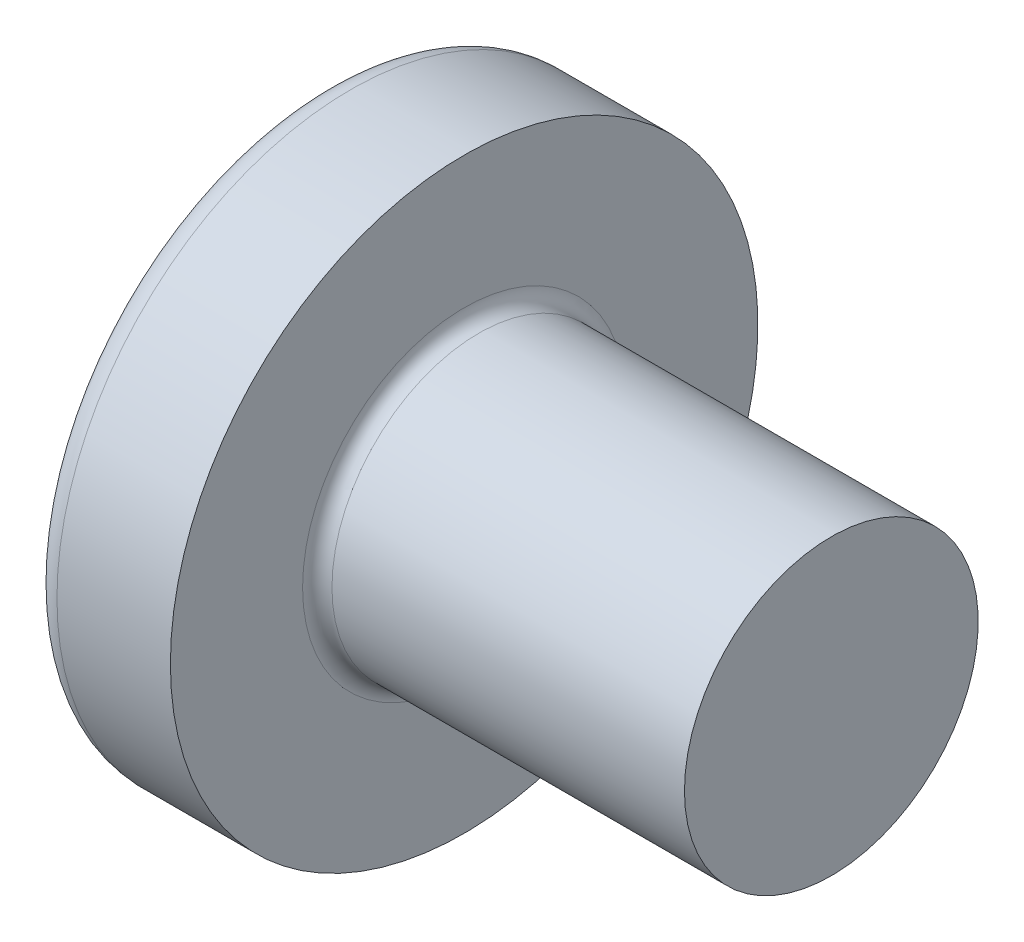
ISO-10303-21;
HEADER;
FILE_DESCRIPTION(('STEP AP214'),'2;1');
FILE_NAME('part.step','',(''),(''),'','','');
FILE_SCHEMA(('AUTOMOTIVE_DESIGN { 1 0 10303 214 1 1 1 1 }'));
ENDSEC;
DATA;
#1=APPLICATION_CONTEXT('core data for automotive mechanical design processes');
#2=APPLICATION_PROTOCOL_DEFINITION('international standard','automotive_design',2000,#1);
#3=PRODUCT_CONTEXT('',#1,'mechanical');
#4=PRODUCT('Part','Part','',(#3));
#5=PRODUCT_RELATED_PRODUCT_CATEGORY('part','',(#4));
#6=PRODUCT_DEFINITION_FORMATION('','',#4);
#7=PRODUCT_DEFINITION_CONTEXT('part definition',#1,'design');
#8=PRODUCT_DEFINITION('design','',#6,#7);
#9=PRODUCT_DEFINITION_SHAPE('','',#8);
#10=(LENGTH_UNIT() NAMED_UNIT(*) SI_UNIT(.MILLI.,.METRE.));
#11=(NAMED_UNIT(*) PLANE_ANGLE_UNIT() SI_UNIT($,.RADIAN.));
#12=(NAMED_UNIT(*) SI_UNIT($,.STERADIAN.) SOLID_ANGLE_UNIT());
#13=UNCERTAINTY_MEASURE_WITH_UNIT(LENGTH_MEASURE(1.E-05),#10,'distance_accuracy_value','');
#14=(GEOMETRIC_REPRESENTATION_CONTEXT(3) GLOBAL_UNCERTAINTY_ASSIGNED_CONTEXT((#13)) GLOBAL_UNIT_ASSIGNED_CONTEXT((#10,
#11,#12)) REPRESENTATION_CONTEXT('',''));
#15=CARTESIAN_POINT('',(0.,0.,0.));
#16=DIRECTION('',(0.,0.,1.));
#17=DIRECTION('',(1.,0.,0.));
#18=AXIS2_PLACEMENT_3D('',#15,#16,#17);
#19=CARTESIAN_POINT('',(6.5,0.,0.));
#20=DIRECTION('',(-1.,0.,0.));
#21=DIRECTION('',(0.,1.,0.));
#22=AXIS2_PLACEMENT_3D('',#19,#20,#21);
#23=SPHERICAL_SURFACE('',#22,6.5);
#24=CARTESIAN_POINT('',(1.26538895452803,0.,0.));
#25=DIRECTION('',(-1.,0.,0.));
#26=DIRECTION('',(0.,0.,1.));
#27=AXIS2_PLACEMENT_3D('',#24,#25,#26);
#28=CIRCLE('',#27,3.85342019543974);
#29=CARTESIAN_POINT('',(1.26538895452803,0.,3.85342019543974));
#30=VERTEX_POINT('',#29);
#31=EDGE_CURVE('E226',#30,#30,#28,.T.);
#32=ORIENTED_EDGE('',*,*,#31,.T.);
#33=EDGE_LOOP('',(#32));
#34=FACE_BOUND('',#33,.T.);
#35=CARTESIAN_POINT('',(0.0788099820016241,0.,0.));
#36=DIRECTION('',(1.,0.,0.));
#37=DIRECTION('',(0.,0.,-1.));
#38=AXIS2_PLACEMENT_3D('',#35,#36,#37);
#39=CIRCLE('',#38,1.0091178091571);
#40=CARTESIAN_POINT('',(0.0788099820016238,-0.514999999999996,-0.867809744562728));
#41=VERTEX_POINT('',#40);
#42=CARTESIAN_POINT('',(0.0788099820016241,-0.867809744562729,-0.515));
#43=VERTEX_POINT('',#42);
#44=EDGE_CURVE('E385',#41,#43,#39,.F.);
#45=ORIENTED_EDGE('',*,*,#44,.F.);
#46=CARTESIAN_POINT('',(6.5,-0.515,0.));
#47=DIRECTION('',(0.,1.,0.));
#48=DIRECTION('',(0.,0.,1.));
#49=AXIS2_PLACEMENT_3D('',#46,#47,#48);
#50=CIRCLE('',#49,6.47956595768575);
#51=CARTESIAN_POINT('',(0.331830520157864,-0.514999999999992,-1.98455543332606));
#52=VERTEX_POINT('',#51);
#53=EDGE_CURVE('E301',#52,#41,#50,.T.);
#54=ORIENTED_EDGE('',*,*,#53,.F.);
#55=CARTESIAN_POINT('',(6.06443225879636,0.,0.873613881877686));
#56=DIRECTION('',(0.446197753347362,0.,-0.89493439139848));
#57=DIRECTION('',(-0.89493439139848,0.,-0.446197753347362));
#58=AXIS2_PLACEMENT_3D('',#55,#56,#57);
#59=CIRCLE('',#58,6.42628038045441);
#60=CARTESIAN_POINT('',(0.331830520157865,0.515000000000007,-1.98455543332606));
#61=VERTEX_POINT('',#60);
#62=EDGE_CURVE('E270',#52,#61,#59,.T.);
#63=ORIENTED_EDGE('',*,*,#62,.T.);
#64=CARTESIAN_POINT('',(6.5,0.515,0.));
#65=DIRECTION('',(0.,-1.,0.));
#66=DIRECTION('',(0.,0.,-1.));
#67=AXIS2_PLACEMENT_3D('',#64,#65,#66);
#68=CIRCLE('',#67,6.47956595768574);
#69=CARTESIAN_POINT('',(0.0788099820016253,0.515000000000003,-0.867809744562724));
#70=VERTEX_POINT('',#69);
#71=EDGE_CURVE('E337',#70,#61,#68,.T.);
#72=ORIENTED_EDGE('',*,*,#71,.F.);
#73=CARTESIAN_POINT('',(0.0788099820016241,0.867809744562719,-0.515));
#74=VERTEX_POINT('',#73);
#75=EDGE_CURVE('E406',#74,#70,#39,.F.);
#76=ORIENTED_EDGE('',*,*,#75,.F.);
#77=CARTESIAN_POINT('',(6.5,0.,-0.515));
#78=DIRECTION('',(0.,0.,1.));
#79=DIRECTION('',(1.,0.,0.));
#80=AXIS2_PLACEMENT_3D('',#77,#78,#79);
#81=CIRCLE('',#80,6.47956595768574);
#82=CARTESIAN_POINT('',(0.331830520157846,1.984555433326,-0.515));
#83=VERTEX_POINT('',#82);
#84=EDGE_CURVE('E262',#83,#74,#81,.T.);
#85=ORIENTED_EDGE('',*,*,#84,.F.);
#86=CARTESIAN_POINT('',(6.06443225879571,-0.873613881878621,0.));
#87=DIRECTION('',(0.44619775334751,0.894934391398406,0.));
#88=DIRECTION('',(-0.894934391398405,0.44619775334751,0.));
#89=AXIS2_PLACEMENT_3D('',#86,#87,#88);
#90=CIRCLE('',#89,6.42628038045425);
#91=CARTESIAN_POINT('',(0.331830520157847,1.984555433326,0.514999999999999));
#92=VERTEX_POINT('',#91);
#93=EDGE_CURVE('E266',#83,#92,#90,.T.);
#94=ORIENTED_EDGE('',*,*,#93,.T.);
#95=CARTESIAN_POINT('',(6.5,0.,0.515));
#96=DIRECTION('',(0.,0.,-1.));
#97=DIRECTION('',(0.,1.,0.));
#98=AXIS2_PLACEMENT_3D('',#95,#96,#97);
#99=CIRCLE('',#98,6.47956595768574);
#100=CARTESIAN_POINT('',(0.0788099820016241,0.867809744562719,0.515));
#101=VERTEX_POINT('',#100);
#102=EDGE_CURVE('E257',#101,#92,#99,.T.);
#103=ORIENTED_EDGE('',*,*,#102,.F.);
#104=CARTESIAN_POINT('',(0.0788099820016247,0.514999999999997,0.867809744562727));
#105=VERTEX_POINT('',#104);
#106=EDGE_CURVE('E405',#105,#101,#39,.F.);
#107=ORIENTED_EDGE('',*,*,#106,.F.);
#108=CARTESIAN_POINT('',(0.331830520157846,0.514999999999993,1.984555433326));
#109=VERTEX_POINT('',#108);
#110=EDGE_CURVE('E282',#109,#105,#68,.T.);
#111=ORIENTED_EDGE('',*,*,#110,.F.);
#112=CARTESIAN_POINT('',(6.06443225879571,0.,-0.87361388187862));
#113=DIRECTION('',(0.44619775334751,0.,0.894934391398406));
#114=DIRECTION('',(0.894934391398405,0.,-0.44619775334751));
#115=AXIS2_PLACEMENT_3D('',#112,#113,#114);
#116=CIRCLE('',#115,6.42628038045424);
#117=CARTESIAN_POINT('',(0.331830520157846,-0.515000000000006,1.984555433326));
#118=VERTEX_POINT('',#117);
#119=EDGE_CURVE('E60',#109,#118,#116,.T.);
#120=ORIENTED_EDGE('',*,*,#119,.T.);
#121=CARTESIAN_POINT('',(0.0788099820016244,-0.515000000000003,0.867809744562724));
#122=VERTEX_POINT('',#121);
#123=EDGE_CURVE('E279',#122,#118,#50,.T.);
#124=ORIENTED_EDGE('',*,*,#123,.F.);
#125=CARTESIAN_POINT('',(0.0788099820016241,-0.867809744562729,0.514999999999999));
#126=VERTEX_POINT('',#125);
#127=EDGE_CURVE('E444',#126,#122,#39,.F.);
#128=ORIENTED_EDGE('',*,*,#127,.F.);
#129=CARTESIAN_POINT('',(0.331830520157862,-1.98455543332606,0.514999999999999));
#130=VERTEX_POINT('',#129);
#131=EDGE_CURVE('E258',#130,#126,#99,.T.);
#132=ORIENTED_EDGE('',*,*,#131,.F.);
#133=CARTESIAN_POINT('',(6.06443225879636,0.873613881877685,0.));
#134=DIRECTION('',(0.446197753347362,-0.89493439139848,0.));
#135=DIRECTION('',(0.89493439139848,0.446197753347362,0.));
#136=AXIS2_PLACEMENT_3D('',#133,#134,#135);
#137=CIRCLE('',#136,6.42628038045441);
#138=CARTESIAN_POINT('',(0.331830520157863,-1.98455543332606,-0.515));
#139=VERTEX_POINT('',#138);
#140=EDGE_CURVE('E253',#130,#139,#137,.T.);
#141=ORIENTED_EDGE('',*,*,#140,.T.);
#142=EDGE_CURVE('E75',#43,#139,#81,.T.);
#143=ORIENTED_EDGE('',*,*,#142,.F.);
#144=EDGE_LOOP('',(#45,#54,#63,#72,#76,#85,#94,#103,#107,#111,#120,#124,#128,#132,#141,#143));
#145=FACE_BOUND('',#144,.T.);
#146=ADVANCED_FACE('F45',(#34,#145),#23,.T.);
#147=CARTESIAN_POINT('',(0.,2.15,-0.515));
#148=DIRECTION('',(0.,0.,1.));
#149=DIRECTION('',(1.,0.,0.));
#150=AXIS2_PLACEMENT_3D('',#147,#148,#149);
#151=PLANE('',#150);
#152=ORIENTED_EDGE('',*,*,#84,.T.);
#153=CARTESIAN_POINT('',(-1.51195208675156,0.994972220320188,-0.515));
#154=CARTESIAN_POINT('',(-1.20405981949279,0.970722016949958,-0.515));
#155=CARTESIAN_POINT('',(-0.896180907521173,0.946299109919651,-0.515));
#156=CARTESIAN_POINT('',(-0.280449079832185,0.896981122427851,-0.515));
#157=CARTESIAN_POINT('',(0.0274038344396874,0.872086023934883,-0.515));
#158=CARTESIAN_POINT('',(0.489146739515351,0.83429553519528,-0.515));
#159=CARTESIAN_POINT('',(0.643055047553846,0.821624058404092,-0.515));
#160=CARTESIAN_POINT('',(0.950856520197141,0.796108332639504,-0.515));
#161=CARTESIAN_POINT('',(1.10474968487868,0.783264084592465,-0.515));
#162=CARTESIAN_POINT('',(1.41251352095103,0.757376569093378,-0.515));
#163=CARTESIAN_POINT('',(1.56638419296577,0.744333309065218,-0.515));
#164=CARTESIAN_POINT('',(1.87410847343335,0.718013273188896,-0.515));
#165=CARTESIAN_POINT('',(2.02796208151372,0.704736492982792,-0.515));
#166=CARTESIAN_POINT('',(2.36455311890989,0.675386943006726,-0.515));
#167=CARTESIAN_POINT('',(2.54728562293342,0.659257575640986,-0.515));
#168=CARTESIAN_POINT('',(2.91270624109256,0.626517182479888,-0.515));
#169=CARTESIAN_POINT('',(3.09539435554038,0.609906160177238,-0.515));
#170=CARTESIAN_POINT('',(3.46069832191612,0.576073027116421,-0.515));
#171=CARTESIAN_POINT('',(3.64331417870068,0.558850968932727,-0.515));
#172=CARTESIAN_POINT('',(4.00847437496567,0.523604864540037,-0.515));
#173=CARTESIAN_POINT('',(4.19101871216888,0.505580794604253,-0.515));
#174=CARTESIAN_POINT('',(4.55606208157937,0.468429191666488,-0.515));
#175=CARTESIAN_POINT('',(4.73856107358022,0.449301262281854,-0.515));
#176=CARTESIAN_POINT('',(5.10337547353418,0.409473604748924,-0.515));
#177=CARTESIAN_POINT('',(5.28569089526422,0.38877400510607,-0.515));
#178=CARTESIAN_POINT('',(5.55897278495412,0.355828287527264,-0.515));
#179=CARTESIAN_POINT('',(5.65005277419686,0.344527918782738,-0.515));
#180=CARTESIAN_POINT('',(5.83209904103607,0.321075174263031,-0.515));
#181=CARTESIAN_POINT('',(5.92306532397915,0.308922840209686,-0.515));
#182=CARTESIAN_POINT('',(6.10486078872898,0.28342733445193,-0.515));
#183=CARTESIAN_POINT('',(6.1956899229938,0.270083817601714,-0.515));
#184=CARTESIAN_POINT('',(6.33172773785679,0.248701420809951,-0.515));
#185=CARTESIAN_POINT('',(6.37704304473344,0.241345446705304,-0.515));
#186=CARTESIAN_POINT('',(6.4675722520141,0.226018953559338,-0.515));
#187=CARTESIAN_POINT('',(6.51278614568083,0.218048394864476,-0.515));
#188=CARTESIAN_POINT('',(6.55793125759549,0.209691465274945,-0.515));
#189=B_SPLINE_CURVE_WITH_KNOTS('',3,(#153,#154,#155,#156,#157,#158,#159,#160,#161,#162,#163,
#164,#165,#166,#167,#168,#169,#170,#171,#172,#173,#174,#175,#176,#177,#178,#179,#180,#181,#182,
#183,#184,#185,#186,#187,#188),.UNSPECIFIED.,.F.,.F.,(4,2,2,2,2,2,2,2,2,2,2,2,2,2,2,2,2,4),(0.,
0.926537709781721,1.85311087258339,2.31639796016285,2.77968256468771,3.24294992902055,
3.70622594801777,4.25655436065378,4.80687878359543,5.35715597005738,5.90744944680718,
6.45794177197673,7.008389135274,7.28372117336899,7.55903973750591,7.83443833587749,
7.97216007460855,8.10989070671571),.UNSPECIFIED.);
#190=CARTESIAN_POINT('',(2.34,0.677477674908923,-0.515));
#191=VERTEX_POINT('',#190);
#192=EDGE_CURVE('E429',#74,#191,#189,.T.);
#193=ORIENTED_EDGE('',*,*,#192,.T.);
#194=DIRECTION('',(0.,1.,0.));
#195=VECTOR('',#194,1.);
#196=CARTESIAN_POINT('',(2.34,-0.983319232260985,-0.515));
#197=LINE('',#196,#195);
#198=CARTESIAN_POINT('',(2.34,0.9833192322605,-0.515));
#199=VERTEX_POINT('',#198);
#200=EDGE_CURVE('E366',#191,#199,#197,.T.);
#201=ORIENTED_EDGE('',*,*,#200,.T.);
#202=DIRECTION('',(0.894934391398405,-0.44619775334751,0.));
#203=VECTOR('',#202,1.);
#204=CARTESIAN_POINT('',(0.,2.15,-0.515));
#205=LINE('',#204,#203);
#206=EDGE_CURVE('E227',#83,#199,#205,.T.);
#207=ORIENTED_EDGE('',*,*,#206,.F.);
#208=EDGE_LOOP('',(#152,#193,#201,#207));
#209=FACE_BOUND('',#208,.T.);
#210=ADVANCED_FACE('F181',(#209),#151,.T.);
#211=CARTESIAN_POINT('',(2.34,-0.983319232260985,-0.515));
#212=VERTEX_POINT('',#211);
#213=CARTESIAN_POINT('',(2.34,-0.677477674908923,-0.515));
#214=VERTEX_POINT('',#213);
#215=EDGE_CURVE('E237',#212,#214,#197,.T.);
#216=ORIENTED_EDGE('',*,*,#215,.T.);
#217=CARTESIAN_POINT('',(-1.51195208675156,-0.994972220320188,-0.515));
#218=CARTESIAN_POINT('',(-1.20405981949279,-0.970722016949958,-0.515));
#219=CARTESIAN_POINT('',(-0.896180907521174,-0.946299109919651,-0.515));
#220=CARTESIAN_POINT('',(-0.280449079832186,-0.896981122427851,-0.515));
#221=CARTESIAN_POINT('',(0.0274038344396869,-0.872086023934883,-0.515));
#222=CARTESIAN_POINT('',(0.48914673951535,-0.83429553519528,-0.515));
#223=CARTESIAN_POINT('',(0.643055047553845,-0.821624058404092,-0.515));
#224=CARTESIAN_POINT('',(0.95085652019714,-0.796108332639504,-0.515));
#225=CARTESIAN_POINT('',(1.10474968487868,-0.783264084592466,-0.515));
#226=CARTESIAN_POINT('',(1.41251352095103,-0.757376569093378,-0.515));
#227=CARTESIAN_POINT('',(1.56638419296577,-0.744333309065218,-0.515));
#228=CARTESIAN_POINT('',(1.87410847343335,-0.718013273188896,-0.515));
#229=CARTESIAN_POINT('',(2.02796208151372,-0.704736492982792,-0.515));
#230=CARTESIAN_POINT('',(2.36455311890989,-0.675386943006726,-0.515));
#231=CARTESIAN_POINT('',(2.54728562293342,-0.659257575640986,-0.515));
#232=CARTESIAN_POINT('',(2.91270624109256,-0.626517182479888,-0.515));
#233=CARTESIAN_POINT('',(3.09539435554038,-0.609906160177238,-0.515));
#234=CARTESIAN_POINT('',(3.46069832191613,-0.576073027116421,-0.515));
#235=CARTESIAN_POINT('',(3.64331417870068,-0.558850968932727,-0.515));
#236=CARTESIAN_POINT('',(4.00847437496567,-0.523604864540037,-0.515));
#237=CARTESIAN_POINT('',(4.19101871216888,-0.505580794604253,-0.515));
#238=CARTESIAN_POINT('',(4.55606208157938,-0.468429191666487,-0.515));
#239=CARTESIAN_POINT('',(4.73856107358023,-0.449301262281853,-0.515));
#240=CARTESIAN_POINT('',(5.10337547353419,-0.409473604748924,-0.515));
#241=CARTESIAN_POINT('',(5.28569089526422,-0.388774005106069,-0.515));
#242=CARTESIAN_POINT('',(5.55897278495412,-0.355828287527264,-0.515));
#243=CARTESIAN_POINT('',(5.65005277419686,-0.344527918782738,-0.515));
#244=CARTESIAN_POINT('',(5.83209904103608,-0.321075174263031,-0.515));
#245=CARTESIAN_POINT('',(5.92306532397915,-0.308922840209686,-0.515));
#246=CARTESIAN_POINT('',(6.10486078872898,-0.28342733445193,-0.515));
#247=CARTESIAN_POINT('',(6.1956899229938,-0.270083817601714,-0.515));
#248=CARTESIAN_POINT('',(6.33172773785679,-0.248701420809951,-0.515));
#249=CARTESIAN_POINT('',(6.37704304473344,-0.241345446705304,-0.515));
#250=CARTESIAN_POINT('',(6.4675722520141,-0.226018953559337,-0.515));
#251=CARTESIAN_POINT('',(6.51278614568083,-0.218048394864476,-0.515));
#252=CARTESIAN_POINT('',(6.55793125759549,-0.209691465274944,-0.515));
#253=B_SPLINE_CURVE_WITH_KNOTS('',3,(#217,#218,#219,#220,#221,#222,#223,#224,#225,#226,#227,
#228,#229,#230,#231,#232,#233,#234,#235,#236,#237,#238,#239,#240,#241,#242,#243,#244,#245,#246,
#247,#248,#249,#250,#251,#252),.UNSPECIFIED.,.F.,.F.,(4,2,2,2,2,2,2,2,2,2,2,2,2,2,2,2,2,4),(0.,
0.926537709781721,1.85311087258339,2.31639796016285,2.77968256468771,3.24294992902054,
3.70622594801777,4.25655436065378,4.80687878359544,5.35715597005738,5.90744944680718,
6.45794177197673,7.008389135274,7.28372117336899,7.55903973750591,7.83443833587749,
7.97216007460855,8.10989070671571),.UNSPECIFIED.);
#254=EDGE_CURVE('E404',#214,#43,#253,.F.);
#255=ORIENTED_EDGE('',*,*,#254,.T.);
#256=ORIENTED_EDGE('',*,*,#142,.T.);
#257=DIRECTION('',(0.894934391398479,0.446197753347362,0.));
#258=VECTOR('',#257,1.);
#259=CARTESIAN_POINT('',(0.,-2.15,-0.515));
#260=LINE('',#259,#258);
#261=EDGE_CURVE('E341',#139,#212,#260,.T.);
#262=ORIENTED_EDGE('',*,*,#261,.T.);
#263=EDGE_LOOP('',(#216,#255,#256,#262));
#264=FACE_BOUND('',#263,.T.);
#265=ADVANCED_FACE('F187',(#264),#151,.T.);
#266=CARTESIAN_POINT('',(0.,-2.15,0.514999999999999));
#267=DIRECTION('',(0.,0.,-1.));
#268=DIRECTION('',(0.,1.,0.));
#269=AXIS2_PLACEMENT_3D('',#266,#267,#268);
#270=PLANE('',#269);
#271=DIRECTION('',(0.,-1.,0.));
#272=VECTOR('',#271,1.);
#273=CARTESIAN_POINT('',(2.34,0.9833192322605,0.515));
#274=LINE('',#273,#272);
#275=CARTESIAN_POINT('',(2.34,0.9833192322605,0.515));
#276=VERTEX_POINT('',#275);
#277=CARTESIAN_POINT('',(2.34,0.677477674908923,0.515));
#278=VERTEX_POINT('',#277);
#279=EDGE_CURVE('E352',#276,#278,#274,.T.);
#280=ORIENTED_EDGE('',*,*,#279,.T.);
#281=CARTESIAN_POINT('',(-1.51195208754037,0.994972220382298,0.514999999999999));
#282=CARTESIAN_POINT('',(-1.20405982018868,0.970722017005064,0.514999999999999));
#283=CARTESIAN_POINT('',(-0.896180908124144,0.946299109967689,0.514999999999999));
#284=CARTESIAN_POINT('',(-0.280449080249312,0.896981122461527,0.515));
#285=CARTESIAN_POINT('',(0.0274038341154852,0.872086023961265,0.515));
#286=CARTESIAN_POINT('',(0.489146739371409,0.834295535207136,0.515));
#287=CARTESIAN_POINT('',(0.643055047497245,0.821624058408796,0.515));
#288=CARTESIAN_POINT('',(0.950856520315204,0.796108332629706,0.515));
#289=CARTESIAN_POINT('',(1.10474968508407,0.783264084575318,0.515));
#290=CARTESIAN_POINT('',(1.41251352133103,0.757376569061287,0.515));
#291=CARTESIAN_POINT('',(1.56638419343305,0.744333309025534,0.515));
#292=CARTESIAN_POINT('',(1.87410847407519,0.718013273133716,0.515));
#293=CARTESIAN_POINT('',(2.02796208224283,0.70473649291971,0.515));
#294=CARTESIAN_POINT('',(2.36455311972626,0.675386942934956,0.515));
#295=CARTESIAN_POINT('',(2.5472856237498,0.659257575568568,0.515));
#296=CARTESIAN_POINT('',(2.91270624190895,0.626517182406014,0.515));
#297=CARTESIAN_POINT('',(3.09539435635676,0.609906160102555,0.515));
#298=CARTESIAN_POINT('',(3.46069832273244,0.576073027039889,0.515));
#299=CARTESIAN_POINT('',(3.64331417951694,0.558850968855157,0.515));
#300=CARTESIAN_POINT('',(4.00847437578178,0.523604864460044,0.515));
#301=CARTESIAN_POINT('',(4.1910187129849,0.505580794522876,0.515));
#302=CARTESIAN_POINT('',(4.55606208239526,0.46842919158178,0.515));
#303=CARTESIAN_POINT('',(4.73856107439606,0.449301262195198,0.515));
#304=CARTESIAN_POINT('',(5.10337547434977,0.409473604657435,0.515));
#305=CARTESIAN_POINT('',(5.28569089607961,0.388774005011695,0.515));
#306=CARTESIAN_POINT('',(5.55897278576906,0.355828287427082,0.515));
#307=CARTESIAN_POINT('',(5.65005277501166,0.344527918680368,0.515));
#308=CARTESIAN_POINT('',(5.83209904185046,0.321075174155499,0.515));
#309=CARTESIAN_POINT('',(5.92306532479326,0.30892284009918,0.515));
#310=CARTESIAN_POINT('',(6.10486078954238,0.283427334334152,0.515));
#311=CARTESIAN_POINT('',(6.19568992380676,0.270083817479637,0.515));
#312=CARTESIAN_POINT('',(6.33172773866874,0.248701420679479,0.515));
#313=CARTESIAN_POINT('',(6.377043045545,0.241345446571707,0.515));
#314=CARTESIAN_POINT('',(6.46757225282466,0.226018953418423,0.515));
#315=CARTESIAN_POINT('',(6.51278614649077,0.218048394719368,0.515));
#316=CARTESIAN_POINT('',(6.55793125840465,0.209691465124901,0.515));
#317=B_SPLINE_CURVE_WITH_KNOTS('',3,(#281,#282,#283,#284,#285,#286,#287,#288,#289,#290,#291,
#292,#293,#294,#295,#296,#297,#298,#299,#300,#301,#302,#303,#304,#305,#306,#307,#308,#309,#310,
#311,#312,#313,#314,#315,#316),.UNSPECIFIED.,.F.,.F.,(4,2,2,2,2,2,2,2,2,2,2,2,2,2,2,2,2,4),(0.,
0.926537710061278,1.85311087314258,2.31639796098494,2.77968256577269,3.24294993036838,
3.70622594962848,4.25655436226469,4.80687878520654,5.3571559716686,5.90744944841855,
6.45794177358856,7.00838913688619,7.28372117498157,7.55903973911884,7.83443833749096,
7.97216007622236,8.1098907083299),.UNSPECIFIED.);
#318=EDGE_CURVE('E306',#278,#101,#317,.F.);
#319=ORIENTED_EDGE('',*,*,#318,.T.);
#320=ORIENTED_EDGE('',*,*,#102,.T.);
#321=DIRECTION('',(0.894934391398405,-0.44619775334751,0.));
#322=VECTOR('',#321,1.);
#323=CARTESIAN_POINT('',(0.,2.15,0.515));
#324=LINE('',#323,#322);
#325=EDGE_CURVE('E234',#92,#276,#324,.T.);
#326=ORIENTED_EDGE('',*,*,#325,.T.);
#327=EDGE_LOOP('',(#280,#319,#320,#326));
#328=FACE_BOUND('',#327,.T.);
#329=ADVANCED_FACE('F425',(#328),#270,.T.);
#330=ORIENTED_EDGE('',*,*,#131,.T.);
#331=CARTESIAN_POINT('',(-1.51195208754037,-0.994972220382298,0.514999999999999));
#332=CARTESIAN_POINT('',(-1.20405982018868,-0.970722017005064,0.514999999999999));
#333=CARTESIAN_POINT('',(-0.896180908124144,-0.946299109967689,0.514999999999999));
#334=CARTESIAN_POINT('',(-0.280449080249313,-0.896981122461527,0.514999999999999));
#335=CARTESIAN_POINT('',(0.0274038341154845,-0.872086023961265,0.514999999999999));
#336=CARTESIAN_POINT('',(0.489146739371408,-0.834295535207137,0.514999999999999));
#337=CARTESIAN_POINT('',(0.643055047497244,-0.821624058408796,0.514999999999999));
#338=CARTESIAN_POINT('',(0.950856520315203,-0.796108332629706,0.514999999999999));
#339=CARTESIAN_POINT('',(1.10474968508407,-0.783264084575318,0.514999999999999));
#340=CARTESIAN_POINT('',(1.41251352133103,-0.757376569061287,0.514999999999999));
#341=CARTESIAN_POINT('',(1.56638419343305,-0.744333309025534,0.515));
#342=CARTESIAN_POINT('',(1.87410847407519,-0.718013273133716,0.515));
#343=CARTESIAN_POINT('',(2.02796208224283,-0.70473649291971,0.515));
#344=CARTESIAN_POINT('',(2.36455311972626,-0.675386942934956,0.515));
#345=CARTESIAN_POINT('',(2.5472856237498,-0.659257575568568,0.515));
#346=CARTESIAN_POINT('',(2.91270624190895,-0.626517182406014,0.515));
#347=CARTESIAN_POINT('',(3.09539435635676,-0.609906160102555,0.515));
#348=CARTESIAN_POINT('',(3.46069832273244,-0.576073027039889,0.515));
#349=CARTESIAN_POINT('',(3.64331417951694,-0.558850968855157,0.515));
#350=CARTESIAN_POINT('',(4.00847437578178,-0.523604864460044,0.515));
#351=CARTESIAN_POINT('',(4.1910187129849,-0.505580794522876,0.515));
#352=CARTESIAN_POINT('',(4.55606208239526,-0.46842919158178,0.515));
#353=CARTESIAN_POINT('',(4.73856107439606,-0.449301262195198,0.515));
#354=CARTESIAN_POINT('',(5.10337547434977,-0.409473604657435,0.515));
#355=CARTESIAN_POINT('',(5.28569089607961,-0.388774005011695,0.515));
#356=CARTESIAN_POINT('',(5.55897278576906,-0.355828287427082,0.515));
#357=CARTESIAN_POINT('',(5.65005277501166,-0.344527918680369,0.515));
#358=CARTESIAN_POINT('',(5.83209904185046,-0.3210751741555,0.515));
#359=CARTESIAN_POINT('',(5.92306532479326,-0.308922840099181,0.515));
#360=CARTESIAN_POINT('',(6.10486078954238,-0.283427334334153,0.515));
#361=CARTESIAN_POINT('',(6.19568992380676,-0.270083817479637,0.515));
#362=CARTESIAN_POINT('',(6.33172773866873,-0.248701420679479,0.515));
#363=CARTESIAN_POINT('',(6.37704304554499,-0.241345446571707,0.515));
#364=CARTESIAN_POINT('',(6.46757225282465,-0.226018953418423,0.515));
#365=CARTESIAN_POINT('',(6.51278614649077,-0.218048394719369,0.515));
#366=CARTESIAN_POINT('',(6.55793125840465,-0.209691465124902,0.515));
#367=B_SPLINE_CURVE_WITH_KNOTS('',3,(#331,#332,#333,#334,#335,#336,#337,#338,#339,#340,#341,
#342,#343,#344,#345,#346,#347,#348,#349,#350,#351,#352,#353,#354,#355,#356,#357,#358,#359,#360,
#361,#362,#363,#364,#365,#366),.UNSPECIFIED.,.F.,.F.,(4,2,2,2,2,2,2,2,2,2,2,2,2,2,2,2,2,4),(0.,
0.926537710061278,1.85311087314258,2.31639796098494,2.77968256577269,3.24294993036838,
3.70622594962848,4.2565543622647,4.80687878520654,5.3571559716686,5.90744944841855,
6.45794177358856,7.00838913688619,7.28372117498157,7.55903973911884,7.83443833749096,
7.97216007622236,8.10989070832989),.UNSPECIFIED.);
#368=CARTESIAN_POINT('',(2.34,-0.677477674908923,0.515));
#369=VERTEX_POINT('',#368);
#370=EDGE_CURVE('E445',#126,#369,#367,.T.);
#371=ORIENTED_EDGE('',*,*,#370,.T.);
#372=CARTESIAN_POINT('',(2.34,-0.983319232260985,0.515));
#373=VERTEX_POINT('',#372);
#374=EDGE_CURVE('E355',#369,#373,#274,.T.);
#375=ORIENTED_EDGE('',*,*,#374,.T.);
#376=DIRECTION('',(0.89493439139848,0.446197753347362,0.));
#377=VECTOR('',#376,1.);
#378=CARTESIAN_POINT('',(0.,-2.15,0.514999999999999));
#379=LINE('',#378,#377);
#380=EDGE_CURVE('E344',#130,#373,#379,.T.);
#381=ORIENTED_EDGE('',*,*,#380,.F.);
#382=EDGE_LOOP('',(#330,#371,#375,#381));
#383=FACE_BOUND('',#382,.T.);
#384=ADVANCED_FACE('F475',(#383),#270,.T.);
#385=CARTESIAN_POINT('',(2.34,0.9833192322605,-0.515));
#386=DIRECTION('',(-1.,0.,0.));
#387=DIRECTION('',(0.,0.,1.));
#388=AXIS2_PLACEMENT_3D('',#385,#386,#387);
#389=PLANE('',#388);
#390=ORIENTED_EDGE('',*,*,#374,.F.);
#391=CARTESIAN_POINT('',(2.34,0.,0.));
#392=DIRECTION('',(-1.,0.,0.));
#393=DIRECTION('',(0.,0.,1.));
#394=AXIS2_PLACEMENT_3D('',#391,#392,#393);
#395=CIRCLE('',#394,0.851);
#396=EDGE_CURVE('E397',#214,#369,#395,.T.);
#397=ORIENTED_EDGE('',*,*,#396,.F.);
#398=ORIENTED_EDGE('',*,*,#215,.F.);
#399=DIRECTION('',(0.,0.,1.));
#400=VECTOR('',#399,1.);
#401=CARTESIAN_POINT('',(2.34,-0.983319232260985,-0.515));
#402=LINE('',#401,#400);
#403=EDGE_CURVE('E348',#212,#373,#402,.T.);
#404=ORIENTED_EDGE('',*,*,#403,.T.);
#405=EDGE_LOOP('',(#390,#397,#398,#404));
#406=FACE_BOUND('',#405,.T.);
#407=ADVANCED_FACE('F468',(#406),#389,.T.);
#408=DIRECTION('',(0.,0.,-1.));
#409=VECTOR('',#408,1.);
#410=CARTESIAN_POINT('',(2.34,-0.515000000000003,0.983319232260498));
#411=LINE('',#410,#409);
#412=CARTESIAN_POINT('',(2.34,-0.514999999999997,-0.677477674908925));
#413=VERTEX_POINT('',#412);
#414=CARTESIAN_POINT('',(2.34,-0.514999999999996,-0.983319232260987));
#415=VERTEX_POINT('',#414);
#416=EDGE_CURVE('E328',#413,#415,#411,.T.);
#417=ORIENTED_EDGE('',*,*,#416,.F.);
#418=CARTESIAN_POINT('',(2.34,0.515000000000002,-0.677477674908921));
#419=VERTEX_POINT('',#418);
#420=EDGE_CURVE('E67',#419,#413,#395,.T.);
#421=ORIENTED_EDGE('',*,*,#420,.F.);
#422=DIRECTION('',(0.,0.,1.));
#423=VECTOR('',#422,1.);
#424=CARTESIAN_POINT('',(2.34,0.515000000000004,-0.983319232260983));
#425=LINE('',#424,#423);
#426=CARTESIAN_POINT('',(2.34,0.515000000000004,-0.983319232260983));
#427=VERTEX_POINT('',#426);
#428=EDGE_CURVE('E332',#427,#419,#425,.T.);
#429=ORIENTED_EDGE('',*,*,#428,.F.);
#430=DIRECTION('',(0.,-1.,0.));
#431=VECTOR('',#430,1.);
#432=CARTESIAN_POINT('',(2.34,0.515000000000004,-0.983319232260983));
#433=LINE('',#432,#431);
#434=EDGE_CURVE('E320',#427,#415,#433,.T.);
#435=ORIENTED_EDGE('',*,*,#434,.T.);
#436=EDGE_LOOP('',(#417,#421,#429,#435));
#437=FACE_BOUND('',#436,.T.);
#438=ADVANCED_FACE('F389',(#437),#389,.T.);
#439=ORIENTED_EDGE('',*,*,#200,.F.);
#440=EDGE_CURVE('E396',#278,#191,#395,.T.);
#441=ORIENTED_EDGE('',*,*,#440,.F.);
#442=ORIENTED_EDGE('',*,*,#279,.F.);
#443=DIRECTION('',(0.,0.,-1.));
#444=VECTOR('',#443,1.);
#445=CARTESIAN_POINT('',(2.34,0.9833192322605,0.515));
#446=LINE('',#445,#444);
#447=EDGE_CURVE('E356',#276,#199,#446,.T.);
#448=ORIENTED_EDGE('',*,*,#447,.T.);
#449=EDGE_LOOP('',(#439,#441,#442,#448));
#450=FACE_BOUND('',#449,.T.);
#451=ADVANCED_FACE('F469',(#450),#389,.T.);
#452=CARTESIAN_POINT('',(0.,0.514999999999993,2.15));
#453=DIRECTION('',(0.,-1.,0.));
#454=DIRECTION('',(1.,0.,0.));
#455=AXIS2_PLACEMENT_3D('',#452,#453,#454);
#456=PLANE('',#455);
#457=ORIENTED_EDGE('',*,*,#110,.T.);
#458=CARTESIAN_POINT('',(-1.51195208754037,0.514999999999997,0.994972220382299));
#459=CARTESIAN_POINT('',(-1.20405982018868,0.514999999999997,0.970722017005065));
#460=CARTESIAN_POINT('',(-0.896180908124144,0.514999999999997,0.94629910996769));
#461=CARTESIAN_POINT('',(-0.280449080249312,0.514999999999997,0.896981122461529));
#462=CARTESIAN_POINT('',(0.0274038341154854,0.514999999999997,0.872086023961266));
#463=CARTESIAN_POINT('',(0.489146739371408,0.514999999999997,0.834295535207138));
#464=CARTESIAN_POINT('',(0.643055047497245,0.514999999999997,0.821624058408798));
#465=CARTESIAN_POINT('',(0.950856520315203,0.514999999999997,0.796108332629707));
#466=CARTESIAN_POINT('',(1.10474968508407,0.514999999999997,0.783264084575319));
#467=CARTESIAN_POINT('',(1.41251352133103,0.514999999999997,0.757376569061289));
#468=CARTESIAN_POINT('',(1.56638419343305,0.514999999999997,0.744333309025536));
#469=CARTESIAN_POINT('',(1.87410847407519,0.514999999999998,0.718013273133718));
#470=CARTESIAN_POINT('',(2.02796208224283,0.514999999999998,0.704736492919711));
#471=CARTESIAN_POINT('',(2.36455311972626,0.514999999999998,0.675386942934957));
#472=CARTESIAN_POINT('',(2.5472856237498,0.514999999999998,0.65925757556857));
#473=CARTESIAN_POINT('',(2.91270624190895,0.514999999999998,0.626517182406015));
#474=CARTESIAN_POINT('',(3.09539435635676,0.514999999999998,0.609906160102556));
#475=CARTESIAN_POINT('',(3.46069832273244,0.514999999999998,0.576073027039891));
#476=CARTESIAN_POINT('',(3.64331417951694,0.514999999999998,0.558850968855158));
#477=CARTESIAN_POINT('',(4.00847437578178,0.514999999999998,0.523604864460046));
#478=CARTESIAN_POINT('',(4.1910187129849,0.514999999999998,0.505580794522878));
#479=CARTESIAN_POINT('',(4.55606208239526,0.514999999999998,0.468429191581782));
#480=CARTESIAN_POINT('',(4.73856107439606,0.514999999999999,0.4493012621952));
#481=CARTESIAN_POINT('',(5.10337547434977,0.514999999999999,0.409473604657437));
#482=CARTESIAN_POINT('',(5.28569089607961,0.514999999999999,0.388774005011697));
#483=CARTESIAN_POINT('',(5.55897278576906,0.514999999999999,0.355828287427084));
#484=CARTESIAN_POINT('',(5.65005277501166,0.514999999999999,0.344527918680371));
#485=CARTESIAN_POINT('',(5.83209904185046,0.514999999999999,0.321075174155502));
#486=CARTESIAN_POINT('',(5.92306532479326,0.514999999999999,0.308922840099183));
#487=CARTESIAN_POINT('',(6.10486078954238,0.514999999999999,0.283427334334155));
#488=CARTESIAN_POINT('',(6.19568992380676,0.514999999999999,0.27008381747964));
#489=CARTESIAN_POINT('',(6.33172773866873,0.514999999999999,0.248701420679482));
#490=CARTESIAN_POINT('',(6.37704304554499,0.514999999999999,0.24134544657171));
#491=CARTESIAN_POINT('',(6.46757225282465,0.514999999999999,0.226018953418426));
#492=CARTESIAN_POINT('',(6.51278614649077,0.514999999999999,0.218048394719371));
#493=CARTESIAN_POINT('',(6.55793125840465,0.514999999999999,0.209691465124904));
#494=B_SPLINE_CURVE_WITH_KNOTS('',3,(#458,#459,#460,#461,#462,#463,#464,#465,#466,#467,#468,
#469,#470,#471,#472,#473,#474,#475,#476,#477,#478,#479,#480,#481,#482,#483,#484,#485,#486,#487,
#488,#489,#490,#491,#492,#493),.UNSPECIFIED.,.F.,.F.,(4,2,2,2,2,2,2,2,2,2,2,2,2,2,2,2,2,4),(0.,
0.926537710061278,1.85311087314258,2.31639796098494,2.77968256577269,3.24294993036838,
3.70622594962848,4.25655436226469,4.80687878520654,5.3571559716686,5.90744944841855,
6.45794177358856,7.00838913688619,7.28372117498157,7.55903973911884,7.83443833749095,
7.97216007622235,8.10989070832989),.UNSPECIFIED.);
#495=CARTESIAN_POINT('',(2.34,0.514999999999998,0.677477674908924));
#496=VERTEX_POINT('',#495);
#497=EDGE_CURVE('E498',#105,#496,#494,.T.);
#498=ORIENTED_EDGE('',*,*,#497,.T.);
#499=CARTESIAN_POINT('',(2.34,0.514999999999997,0.983319232260502));
#500=VERTEX_POINT('',#499);
#501=EDGE_CURVE('E296',#496,#500,#425,.T.);
#502=ORIENTED_EDGE('',*,*,#501,.T.);
#503=DIRECTION('',(0.894934391398405,0.,-0.44619775334751));
#504=VECTOR('',#503,1.);
#505=CARTESIAN_POINT('',(0.,0.514999999999993,2.15));
#506=LINE('',#505,#504);
#507=EDGE_CURVE('E289',#109,#500,#506,.T.);
#508=ORIENTED_EDGE('',*,*,#507,.F.);
#509=EDGE_LOOP('',(#457,#498,#502,#508));
#510=FACE_BOUND('',#509,.T.);
#511=ADVANCED_FACE('F293',(#510),#456,.T.);
#512=CARTESIAN_POINT('',(0.,-0.514999999999992,-2.15));
#513=DIRECTION('',(0.,1.,0.));
#514=DIRECTION('',(0.,0.,1.));
#515=AXIS2_PLACEMENT_3D('',#512,#513,#514);
#516=PLANE('',#515);
#517=CARTESIAN_POINT('',(2.34,-0.515000000000003,0.983319232260498));
#518=VERTEX_POINT('',#517);
#519=CARTESIAN_POINT('',(2.34,-0.515000000000002,0.677477674908921));
#520=VERTEX_POINT('',#519);
#521=EDGE_CURVE('E324',#518,#520,#411,.T.);
#522=ORIENTED_EDGE('',*,*,#521,.T.);
#523=CARTESIAN_POINT('',(-1.51195208675156,-0.515000000000003,0.994972220320186));
#524=CARTESIAN_POINT('',(-1.20405981949279,-0.515000000000003,0.970722016949956));
#525=CARTESIAN_POINT('',(-0.896180907521174,-0.515000000000003,0.946299109919649));
#526=CARTESIAN_POINT('',(-0.280449079832186,-0.515000000000003,0.89698112242785));
#527=CARTESIAN_POINT('',(0.0274038344396867,-0.515000000000003,0.872086023934881));
#528=CARTESIAN_POINT('',(0.48914673951535,-0.515000000000003,0.834295535195279));
#529=CARTESIAN_POINT('',(0.643055047553846,-0.515000000000003,0.821624058404091));
#530=CARTESIAN_POINT('',(0.95085652019714,-0.515000000000003,0.796108332639503));
#531=CARTESIAN_POINT('',(1.10474968487868,-0.515000000000002,0.783264084592464));
#532=CARTESIAN_POINT('',(1.41251352095103,-0.515000000000002,0.757376569093377));
#533=CARTESIAN_POINT('',(1.56638419296577,-0.515000000000002,0.744333309065217));
#534=CARTESIAN_POINT('',(1.87410847343335,-0.515000000000002,0.718013273188894));
#535=CARTESIAN_POINT('',(2.02796208151372,-0.515000000000002,0.70473649298279));
#536=CARTESIAN_POINT('',(2.36455311890989,-0.515000000000002,0.675386943006725));
#537=CARTESIAN_POINT('',(2.54728562293342,-0.515000000000002,0.659257575640984));
#538=CARTESIAN_POINT('',(2.91270624109256,-0.515000000000002,0.626517182479886));
#539=CARTESIAN_POINT('',(3.09539435554038,-0.515000000000002,0.609906160177236));
#540=CARTESIAN_POINT('',(3.46069832191613,-0.515000000000002,0.57607302711642));
#541=CARTESIAN_POINT('',(3.64331417870068,-0.515000000000002,0.558850968932726));
#542=CARTESIAN_POINT('',(4.00847437496567,-0.515000000000002,0.523604864540035));
#543=CARTESIAN_POINT('',(4.19101871216888,-0.515000000000002,0.505580794604251));
#544=CARTESIAN_POINT('',(4.55606208157937,-0.515000000000002,0.468429191666486));
#545=CARTESIAN_POINT('',(4.73856107358023,-0.515000000000002,0.449301262281852));
#546=CARTESIAN_POINT('',(5.10337547353419,-0.515000000000002,0.409473604748922));
#547=CARTESIAN_POINT('',(5.28569089526422,-0.515000000000002,0.388774005106068));
#548=CARTESIAN_POINT('',(5.55897278495412,-0.515000000000001,0.355828287527262));
#549=CARTESIAN_POINT('',(5.65005277419686,-0.515000000000001,0.344527918782736));
#550=CARTESIAN_POINT('',(5.83209904103608,-0.515000000000001,0.321075174263029));
#551=CARTESIAN_POINT('',(5.92306532397915,-0.515000000000001,0.308922840209684));
#552=CARTESIAN_POINT('',(6.10486078872898,-0.515000000000001,0.283427334451928));
#553=CARTESIAN_POINT('',(6.1956899229938,-0.515000000000001,0.270083817601712));
#554=CARTESIAN_POINT('',(6.33172773785679,-0.515000000000001,0.248701420809949));
#555=CARTESIAN_POINT('',(6.37704304473344,-0.515000000000001,0.241345446705302));
#556=CARTESIAN_POINT('',(6.4675722520141,-0.515000000000001,0.226018953559335));
#557=CARTESIAN_POINT('',(6.51278614568083,-0.515000000000001,0.218048394864474));
#558=CARTESIAN_POINT('',(6.55793125759549,-0.515000000000001,0.209691465274942));
#559=B_SPLINE_CURVE_WITH_KNOTS('',3,(#523,#524,#525,#526,#527,#528,#529,#530,#531,#532,#533,
#534,#535,#536,#537,#538,#539,#540,#541,#542,#543,#544,#545,#546,#547,#548,#549,#550,#551,#552,
#553,#554,#555,#556,#557,#558),.UNSPECIFIED.,.F.,.F.,(4,2,2,2,2,2,2,2,2,2,2,2,2,2,2,2,2,4),(0.,
0.926537709781721,1.85311087258339,2.31639796016285,2.77968256468771,3.24294992902054,
3.70622594801777,4.25655436065378,4.80687878359543,5.35715597005738,5.90744944680718,
6.45794177197673,7.008389135274,7.28372117336899,7.55903973750591,7.83443833587749,
7.97216007460855,8.10989070671571),.UNSPECIFIED.);
#560=EDGE_CURVE('E436',#520,#122,#559,.F.);
#561=ORIENTED_EDGE('',*,*,#560,.T.);
#562=ORIENTED_EDGE('',*,*,#123,.T.);
#563=DIRECTION('',(0.894934391398405,0.,-0.44619775334751));
#564=VECTOR('',#563,1.);
#565=CARTESIAN_POINT('',(0.,-0.515000000000007,2.15));
#566=LINE('',#565,#564);
#567=EDGE_CURVE('E291',#118,#518,#566,.T.);
#568=ORIENTED_EDGE('',*,*,#567,.T.);
#569=EDGE_LOOP('',(#522,#561,#562,#568));
#570=FACE_BOUND('',#569,.T.);
#571=ADVANCED_FACE('F216',(#570),#516,.T.);
#572=ORIENTED_EDGE('',*,*,#428,.T.);
#573=CARTESIAN_POINT('',(-1.51195208754037,0.515000000000004,-0.994972220382296));
#574=CARTESIAN_POINT('',(-1.20405982018868,0.515000000000003,-0.970722017005062));
#575=CARTESIAN_POINT('',(-0.896180908124144,0.515000000000003,-0.946299109967687));
#576=CARTESIAN_POINT('',(-0.280449080249312,0.515000000000003,-0.896981122461525));
#577=CARTESIAN_POINT('',(0.027403834115485,0.515000000000003,-0.872086023961263));
#578=CARTESIAN_POINT('',(0.489146739371408,0.515000000000003,-0.834295535207134));
#579=CARTESIAN_POINT('',(0.643055047497245,0.515000000000003,-0.821624058408794));
#580=CARTESIAN_POINT('',(0.950856520315203,0.515000000000003,-0.796108332629704));
#581=CARTESIAN_POINT('',(1.10474968508407,0.515000000000003,-0.783264084575315));
#582=CARTESIAN_POINT('',(1.41251352133103,0.515000000000003,-0.757376569061285));
#583=CARTESIAN_POINT('',(1.56638419343305,0.515000000000003,-0.744333309025532));
#584=CARTESIAN_POINT('',(1.87410847407519,0.515000000000003,-0.718013273133714));
#585=CARTESIAN_POINT('',(2.02796208224283,0.515000000000002,-0.704736492919708));
#586=CARTESIAN_POINT('',(2.36455311972626,0.515000000000002,-0.675386942934954));
#587=CARTESIAN_POINT('',(2.5472856237498,0.515000000000002,-0.659257575568566));
#588=CARTESIAN_POINT('',(2.91270624190895,0.515000000000002,-0.626517182406012));
#589=CARTESIAN_POINT('',(3.09539435635676,0.515000000000002,-0.609906160102553));
#590=CARTESIAN_POINT('',(3.46069832273244,0.515000000000002,-0.576073027039887));
#591=CARTESIAN_POINT('',(3.64331417951694,0.515000000000002,-0.558850968855155));
#592=CARTESIAN_POINT('',(4.00847437578178,0.515000000000002,-0.523604864460043));
#593=CARTESIAN_POINT('',(4.1910187129849,0.515000000000002,-0.505580794522874));
#594=CARTESIAN_POINT('',(4.55606208239526,0.515000000000002,-0.468429191581778));
#595=CARTESIAN_POINT('',(4.73856107439606,0.515000000000002,-0.449301262195196));
#596=CARTESIAN_POINT('',(5.10337547434977,0.515000000000001,-0.409473604657433));
#597=CARTESIAN_POINT('',(5.2856908960796,0.515000000000001,-0.388774005011694));
#598=CARTESIAN_POINT('',(5.55897278576906,0.515000000000001,-0.355828287427081));
#599=CARTESIAN_POINT('',(5.65005277501166,0.515000000000001,-0.344527918680367));
#600=CARTESIAN_POINT('',(5.83209904185046,0.515000000000001,-0.321075174155498));
#601=CARTESIAN_POINT('',(5.92306532479326,0.515000000000001,-0.308922840099179));
#602=CARTESIAN_POINT('',(6.10486078954238,0.515000000000001,-0.283427334334151));
#603=CARTESIAN_POINT('',(6.19568992380675,0.515000000000001,-0.270083817479636));
#604=CARTESIAN_POINT('',(6.33172773866873,0.515000000000001,-0.248701420679478));
#605=CARTESIAN_POINT('',(6.37704304554499,0.515000000000001,-0.241345446571706));
#606=CARTESIAN_POINT('',(6.46757225282465,0.515000000000001,-0.226018953418422));
#607=CARTESIAN_POINT('',(6.51278614649077,0.515000000000001,-0.218048394719368));
#608=CARTESIAN_POINT('',(6.55793125840465,0.515000000000001,-0.2096914651249));
#609=B_SPLINE_CURVE_WITH_KNOTS('',3,(#573,#574,#575,#576,#577,#578,#579,#580,#581,#582,#583,
#584,#585,#586,#587,#588,#589,#590,#591,#592,#593,#594,#595,#596,#597,#598,#599,#600,#601,#602,
#603,#604,#605,#606,#607,#608),.UNSPECIFIED.,.F.,.F.,(4,2,2,2,2,2,2,2,2,2,2,2,2,2,2,2,2,4),(0.,
0.926537710061278,1.85311087314258,2.31639796098494,2.77968256577269,3.24294993036838,
3.70622594962848,4.25655436226469,4.80687878520654,5.3571559716686,5.90744944841854,
6.45794177358856,7.00838913688618,7.28372117498157,7.55903973911884,7.83443833749096,
7.97216007622235,8.10989070832989),.UNSPECIFIED.);
#610=EDGE_CURVE('E377',#419,#70,#609,.F.);
#611=ORIENTED_EDGE('',*,*,#610,.T.);
#612=ORIENTED_EDGE('',*,*,#71,.T.);
#613=DIRECTION('',(0.894934391398479,0.,0.446197753347362));
#614=VECTOR('',#613,1.);
#615=CARTESIAN_POINT('',(0.,0.515000000000008,-2.15));
#616=LINE('',#615,#614);
#617=EDGE_CURVE('E303',#61,#427,#616,.T.);
#618=ORIENTED_EDGE('',*,*,#617,.T.);
#619=EDGE_LOOP('',(#572,#611,#612,#618));
#620=FACE_BOUND('',#619,.T.);
#621=ADVANCED_FACE('F214',(#620),#456,.T.);
#622=ORIENTED_EDGE('',*,*,#53,.T.);
#623=CARTESIAN_POINT('',(-1.51195208754037,-0.514999999999996,-0.9949722203823));
#624=CARTESIAN_POINT('',(-1.20405982018868,-0.514999999999996,-0.970722017005066));
#625=CARTESIAN_POINT('',(-0.896180908124144,-0.514999999999996,-0.946299109967691));
#626=CARTESIAN_POINT('',(-0.280449080249313,-0.514999999999996,-0.896981122461529));
#627=CARTESIAN_POINT('',(0.0274038341154846,-0.514999999999996,-0.872086023961267));
#628=CARTESIAN_POINT('',(0.489146739371408,-0.514999999999997,-0.834295535207138));
#629=CARTESIAN_POINT('',(0.643055047497244,-0.514999999999997,-0.821624058408798));
#630=CARTESIAN_POINT('',(0.950856520315203,-0.514999999999997,-0.796108332629708));
#631=CARTESIAN_POINT('',(1.10474968508407,-0.514999999999997,-0.783264084575319));
#632=CARTESIAN_POINT('',(1.41251352133103,-0.514999999999997,-0.757376569061289));
#633=CARTESIAN_POINT('',(1.56638419343305,-0.514999999999997,-0.744333309025536));
#634=CARTESIAN_POINT('',(1.87410847407519,-0.514999999999997,-0.718013273133718));
#635=CARTESIAN_POINT('',(2.02796208224283,-0.514999999999997,-0.704736492919712));
#636=CARTESIAN_POINT('',(2.36455311972626,-0.514999999999997,-0.675386942934958));
#637=CARTESIAN_POINT('',(2.5472856237498,-0.514999999999997,-0.65925757556857));
#638=CARTESIAN_POINT('',(2.91270624190895,-0.514999999999998,-0.626517182406016));
#639=CARTESIAN_POINT('',(3.09539435635676,-0.514999999999998,-0.609906160102557));
#640=CARTESIAN_POINT('',(3.46069832273244,-0.514999999999998,-0.576073027039891));
#641=CARTESIAN_POINT('',(3.64331417951694,-0.514999999999998,-0.558850968855159));
#642=CARTESIAN_POINT('',(4.00847437578178,-0.514999999999998,-0.523604864460046));
#643=CARTESIAN_POINT('',(4.1910187129849,-0.514999999999998,-0.505580794522878));
#644=CARTESIAN_POINT('',(4.55606208239526,-0.514999999999998,-0.468429191581782));
#645=CARTESIAN_POINT('',(4.73856107439606,-0.514999999999998,-0.4493012621952));
#646=CARTESIAN_POINT('',(5.10337547434977,-0.514999999999999,-0.409473604657437));
#647=CARTESIAN_POINT('',(5.28569089607961,-0.514999999999999,-0.388774005011697));
#648=CARTESIAN_POINT('',(5.55897278576906,-0.514999999999999,-0.355828287427084));
#649=CARTESIAN_POINT('',(5.65005277501166,-0.514999999999999,-0.344527918680371));
#650=CARTESIAN_POINT('',(5.83209904185046,-0.514999999999999,-0.321075174155502));
#651=CARTESIAN_POINT('',(5.92306532479326,-0.514999999999999,-0.308922840099183));
#652=CARTESIAN_POINT('',(6.10486078954238,-0.514999999999999,-0.283427334334154));
#653=CARTESIAN_POINT('',(6.19568992380676,-0.514999999999999,-0.270083817479639));
#654=CARTESIAN_POINT('',(6.33172773866873,-0.514999999999999,-0.248701420679481));
#655=CARTESIAN_POINT('',(6.37704304554499,-0.514999999999999,-0.241345446571709));
#656=CARTESIAN_POINT('',(6.46757225282465,-0.514999999999999,-0.226018953418425));
#657=CARTESIAN_POINT('',(6.51278614649077,-0.514999999999999,-0.218048394719371));
#658=CARTESIAN_POINT('',(6.55793125840465,-0.514999999999999,-0.209691465124903));
#659=B_SPLINE_CURVE_WITH_KNOTS('',3,(#623,#624,#625,#626,#627,#628,#629,#630,#631,#632,#633,
#634,#635,#636,#637,#638,#639,#640,#641,#642,#643,#644,#645,#646,#647,#648,#649,#650,#651,#652,
#653,#654,#655,#656,#657,#658),.UNSPECIFIED.,.F.,.F.,(4,2,2,2,2,2,2,2,2,2,2,2,2,2,2,2,2,4),(0.,
0.926537710061278,1.85311087314258,2.31639796098494,2.77968256577269,3.24294993036838,
3.70622594962848,4.25655436226469,4.80687878520654,5.3571559716686,5.90744944841855,
6.45794177358856,7.00838913688619,7.28372117498157,7.55903973911884,7.83443833749096,
7.97216007622236,8.10989070832989),.UNSPECIFIED.);
#660=EDGE_CURVE('E11',#41,#413,#659,.T.);
#661=ORIENTED_EDGE('',*,*,#660,.T.);
#662=ORIENTED_EDGE('',*,*,#416,.T.);
#663=DIRECTION('',(0.89493439139848,0.,0.446197753347362));
#664=VECTOR('',#663,1.);
#665=CARTESIAN_POINT('',(0.,-0.514999999999992,-2.15));
#666=LINE('',#665,#664);
#667=EDGE_CURVE('E316',#52,#415,#666,.T.);
#668=ORIENTED_EDGE('',*,*,#667,.F.);
#669=EDGE_LOOP('',(#622,#661,#662,#668));
#670=FACE_BOUND('',#669,.T.);
#671=ADVANCED_FACE('F209',(#670),#516,.T.);
#672=CARTESIAN_POINT('',(-25.4,0.,0.));
#673=DIRECTION('',(-1.,0.,0.));
#674=DIRECTION('',(0.,0.,1.));
#675=AXIS2_PLACEMENT_3D('',#672,#673,#674);
#676=CYLINDRICAL_SURFACE('',#675,2.);
#677=CARTESIAN_POINT('',(3.3,0.,0.));
#678=DIRECTION('',(-1.,0.,0.));
#679=DIRECTION('',(0.,0.,1.));
#680=AXIS2_PLACEMENT_3D('',#677,#678,#679);
#681=CIRCLE('',#680,2.);
#682=CARTESIAN_POINT('',(3.3,0.,2.));
#683=VERTEX_POINT('',#682);
#684=EDGE_CURVE('E220',#683,#683,#681,.F.);
#685=ORIENTED_EDGE('',*,*,#684,.T.);
#686=EDGE_LOOP('',(#685));
#687=FACE_BOUND('',#686,.T.);
#688=CARTESIAN_POINT('',(8.1,0.,0.));
#689=DIRECTION('',(-1.,0.,0.));
#690=DIRECTION('',(0.,0.,1.));
#691=AXIS2_PLACEMENT_3D('',#688,#689,#690);
#692=CIRCLE('',#691,2.);
#693=CARTESIAN_POINT('',(8.1,0.,2.));
#694=VERTEX_POINT('',#693);
#695=EDGE_CURVE('E223',#694,#694,#692,.T.);
#696=ORIENTED_EDGE('',*,*,#695,.T.);
#697=EDGE_LOOP('',(#696));
#698=FACE_BOUND('',#697,.T.);
#699=ADVANCED_FACE('F206',(#687,#698),#676,.T.);
#700=CARTESIAN_POINT('',(3.1,2.,0.));
#701=DIRECTION('',(-1.,0.,0.));
#702=DIRECTION('',(0.,0.,1.));
#703=AXIS2_PLACEMENT_3D('',#700,#701,#702);
#704=PLANE('',#703);
#705=CARTESIAN_POINT('',(3.1,0.,0.));
#706=DIRECTION('',(-1.,0.,0.));
#707=DIRECTION('',(0.,0.,1.));
#708=AXIS2_PLACEMENT_3D('',#705,#706,#707);
#709=CIRCLE('',#708,2.2);
#710=CARTESIAN_POINT('',(3.1,0.,2.2));
#711=VERTEX_POINT('',#710);
#712=EDGE_CURVE('E247',#711,#711,#709,.T.);
#713=ORIENTED_EDGE('',*,*,#712,.T.);
#714=EDGE_LOOP('',(#713));
#715=FACE_BOUND('',#714,.T.);
#716=CARTESIAN_POINT('',(3.1,0.,0.));
#717=DIRECTION('',(-1.,0.,0.));
#718=DIRECTION('',(0.,0.,1.));
#719=AXIS2_PLACEMENT_3D('',#716,#717,#718);
#720=CIRCLE('',#719,4.);
#721=CARTESIAN_POINT('',(3.1,0.,4.));
#722=VERTEX_POINT('',#721);
#723=EDGE_CURVE('E243',#722,#722,#720,.T.);
#724=ORIENTED_EDGE('',*,*,#723,.F.);
#725=EDGE_LOOP('',(#724));
#726=FACE_BOUND('',#725,.T.);
#727=ADVANCED_FACE('F203',(#715,#726),#704,.F.);
#728=CARTESIAN_POINT('',(-25.4,0.,0.));
#729=DIRECTION('',(-1.,0.,0.));
#730=DIRECTION('',(0.,0.,1.));
#731=AXIS2_PLACEMENT_3D('',#728,#729,#730);
#732=CYLINDRICAL_SURFACE('',#731,4.);
#733=ORIENTED_EDGE('',*,*,#723,.T.);
#734=EDGE_LOOP('',(#733));
#735=FACE_BOUND('',#734,.T.);
#736=CARTESIAN_POINT('',(1.55530587396956,0.,0.));
#737=DIRECTION('',(-1.,0.,0.));
#738=DIRECTION('',(0.,0.,1.));
#739=AXIS2_PLACEMENT_3D('',#736,#737,#738);
#740=CIRCLE('',#739,4.);
#741=CARTESIAN_POINT('',(1.55530587396956,0.,4.));
#742=VERTEX_POINT('',#741);
#743=EDGE_CURVE('E231',#742,#742,#740,.T.);
#744=ORIENTED_EDGE('',*,*,#743,.F.);
#745=EDGE_LOOP('',(#744));
#746=FACE_BOUND('',#745,.T.);
#747=ADVANCED_FACE('F199',(#735,#746),#732,.T.);
#748=CARTESIAN_POINT('',(1.55530587396956,0.,0.));
#749=DIRECTION('',(-1.,0.,0.));
#750=DIRECTION('',(0.,0.,1.));
#751=AXIS2_PLACEMENT_3D('',#748,#749,#750);
#752=TOROIDAL_SURFACE('',#751,3.64,0.36);
#753=ORIENTED_EDGE('',*,*,#743,.T.);
#754=EDGE_LOOP('',(#753));
#755=FACE_BOUND('',#754,.T.);
#756=ORIENTED_EDGE('',*,*,#31,.F.);
#757=EDGE_LOOP('',(#756));
#758=FACE_BOUND('',#757,.T.);
#759=ADVANCED_FACE('F196',(#755,#758),#752,.T.);
#760=CARTESIAN_POINT('',(8.1,2.,0.));
#761=DIRECTION('',(1.,0.,0.));
#762=DIRECTION('',(0.,0.,-1.));
#763=AXIS2_PLACEMENT_3D('',#760,#761,#762);
#764=PLANE('',#763);
#765=ORIENTED_EDGE('',*,*,#695,.F.);
#766=EDGE_LOOP('',(#765));
#767=FACE_BOUND('',#766,.T.);
#768=ADVANCED_FACE('F194',(#767),#764,.T.);
#769=CARTESIAN_POINT('',(3.3,0.,0.));
#770=DIRECTION('',(-1.,0.,0.));
#771=DIRECTION('',(0.,0.,1.));
#772=AXIS2_PLACEMENT_3D('',#769,#770,#771);
#773=TOROIDAL_SURFACE('',#772,2.2,0.2);
#774=ORIENTED_EDGE('',*,*,#684,.F.);
#775=EDGE_LOOP('',(#774));
#776=FACE_BOUND('',#775,.T.);
#777=ORIENTED_EDGE('',*,*,#712,.F.);
#778=EDGE_LOOP('',(#777));
#779=FACE_BOUND('',#778,.T.);
#780=ADVANCED_FACE('F47',(#776,#779),#773,.F.);
#781=CARTESIAN_POINT('',(2.34,0.9833192322605,0.515));
#782=DIRECTION('',(0.44619775334751,0.894934391398406,0.));
#783=DIRECTION('',(-0.894934391398405,0.44619775334751,0.));
#784=AXIS2_PLACEMENT_3D('',#781,#782,#783);
#785=PLANE('',#784);
#786=ORIENTED_EDGE('',*,*,#206,.T.);
#787=ORIENTED_EDGE('',*,*,#447,.F.);
#788=ORIENTED_EDGE('',*,*,#325,.F.);
#789=ORIENTED_EDGE('',*,*,#93,.F.);
#790=EDGE_LOOP('',(#786,#787,#788,#789));
#791=FACE_BOUND('',#790,.T.);
#792=ADVANCED_FACE('F423',(#791),#785,.F.);
#793=CARTESIAN_POINT('',(0.,-2.15,-0.515));
#794=DIRECTION('',(0.446197753347362,-0.89493439139848,0.));
#795=DIRECTION('',(0.89493439139848,0.446197753347362,0.));
#796=AXIS2_PLACEMENT_3D('',#793,#794,#795);
#797=PLANE('',#796);
#798=ORIENTED_EDGE('',*,*,#380,.T.);
#799=ORIENTED_EDGE('',*,*,#403,.F.);
#800=ORIENTED_EDGE('',*,*,#261,.F.);
#801=ORIENTED_EDGE('',*,*,#140,.F.);
#802=EDGE_LOOP('',(#798,#799,#800,#801));
#803=FACE_BOUND('',#802,.T.);
#804=ADVANCED_FACE('F466',(#803),#797,.F.);
#805=ORIENTED_EDGE('',*,*,#501,.F.);
#806=EDGE_CURVE('E401',#520,#496,#395,.T.);
#807=ORIENTED_EDGE('',*,*,#806,.F.);
#808=ORIENTED_EDGE('',*,*,#521,.F.);
#809=DIRECTION('',(0.,1.,0.));
#810=VECTOR('',#809,1.);
#811=CARTESIAN_POINT('',(2.34,-0.515000000000003,0.983319232260498));
#812=LINE('',#811,#810);
#813=EDGE_CURVE('E329',#518,#500,#812,.T.);
#814=ORIENTED_EDGE('',*,*,#813,.T.);
#815=EDGE_LOOP('',(#805,#807,#808,#814));
#816=FACE_BOUND('',#815,.T.);
#817=ADVANCED_FACE('F462',(#816),#389,.T.);
#818=CARTESIAN_POINT('',(2.34,-0.515000000000003,0.983319232260498));
#819=DIRECTION('',(0.44619775334751,0.,0.894934391398406));
#820=DIRECTION('',(-0.894934391398405,0.,0.44619775334751));
#821=AXIS2_PLACEMENT_3D('',#818,#819,#820);
#822=PLANE('',#821);
#823=ORIENTED_EDGE('',*,*,#507,.T.);
#824=ORIENTED_EDGE('',*,*,#813,.F.);
#825=ORIENTED_EDGE('',*,*,#567,.F.);
#826=ORIENTED_EDGE('',*,*,#119,.F.);
#827=EDGE_LOOP('',(#823,#824,#825,#826));
#828=FACE_BOUND('',#827,.T.);
#829=ADVANCED_FACE('F287',(#828),#822,.F.);
#830=CARTESIAN_POINT('',(0.,0.515000000000008,-2.15));
#831=DIRECTION('',(0.446197753347362,0.,-0.89493439139848));
#832=DIRECTION('',(0.89493439139848,0.,0.446197753347362));
#833=AXIS2_PLACEMENT_3D('',#830,#831,#832);
#834=PLANE('',#833);
#835=ORIENTED_EDGE('',*,*,#667,.T.);
#836=ORIENTED_EDGE('',*,*,#434,.F.);
#837=ORIENTED_EDGE('',*,*,#617,.F.);
#838=ORIENTED_EDGE('',*,*,#62,.F.);
#839=EDGE_LOOP('',(#835,#836,#837,#838));
#840=FACE_BOUND('',#839,.T.);
#841=ADVANCED_FACE('F380',(#840),#834,.F.);
#842=CARTESIAN_POINT('',(2.34,0.,0.));
#843=DIRECTION('',(-1.,0.,0.));
#844=DIRECTION('',(0.,0.,1.));
#845=AXIS2_PLACEMENT_3D('',#842,#843,#844);
#846=CONICAL_SURFACE('',#845,0.851,0.0698131700797659);
#847=EDGE_CURVE('E398',#496,#278,#395,.T.);
#848=ORIENTED_EDGE('',*,*,#847,.F.);
#849=ORIENTED_EDGE('',*,*,#497,.F.);
#850=ORIENTED_EDGE('',*,*,#106,.T.);
#851=ORIENTED_EDGE('',*,*,#318,.F.);
#852=EDGE_LOOP('',(#848,#849,#850,#851));
#853=FACE_BOUND('',#852,.T.);
#854=ADVANCED_FACE('F178',(#853),#846,.F.);
#855=ORIENTED_EDGE('',*,*,#127,.T.);
#856=ORIENTED_EDGE('',*,*,#560,.F.);
#857=EDGE_CURVE('E512',#369,#520,#395,.T.);
#858=ORIENTED_EDGE('',*,*,#857,.F.);
#859=ORIENTED_EDGE('',*,*,#370,.F.);
#860=EDGE_LOOP('',(#855,#856,#858,#859));
#861=FACE_BOUND('',#860,.T.);
#862=ADVANCED_FACE('F460',(#861),#846,.F.);
#863=ORIENTED_EDGE('',*,*,#75,.T.);
#864=ORIENTED_EDGE('',*,*,#610,.F.);
#865=EDGE_CURVE('E391',#191,#419,#395,.T.);
#866=ORIENTED_EDGE('',*,*,#865,.F.);
#867=ORIENTED_EDGE('',*,*,#192,.F.);
#868=EDGE_LOOP('',(#863,#864,#866,#867));
#869=FACE_BOUND('',#868,.T.);
#870=ADVANCED_FACE('F176',(#869),#846,.F.);
#871=EDGE_CURVE('E392',#413,#214,#395,.T.);
#872=ORIENTED_EDGE('',*,*,#871,.F.);
#873=ORIENTED_EDGE('',*,*,#660,.F.);
#874=ORIENTED_EDGE('',*,*,#44,.T.);
#875=ORIENTED_EDGE('',*,*,#254,.F.);
#876=EDGE_LOOP('',(#872,#873,#874,#875));
#877=FACE_BOUND('',#876,.T.);
#878=ADVANCED_FACE('F171',(#877),#846,.F.);
#879=CARTESIAN_POINT('',(2.6165066614942,0.,0.));
#880=DIRECTION('',(-1.,0.,0.));
#881=DIRECTION('',(0.,0.,1.));
#882=AXIS2_PLACEMENT_3D('',#879,#880,#881);
#883=CONICAL_SURFACE('',#882,0.,1.25663706143592);
#884=ORIENTED_EDGE('',*,*,#847,.T.);
#885=ORIENTED_EDGE('',*,*,#440,.T.);
#886=ORIENTED_EDGE('',*,*,#865,.T.);
#887=ORIENTED_EDGE('',*,*,#420,.T.);
#888=ORIENTED_EDGE('',*,*,#871,.T.);
#889=ORIENTED_EDGE('',*,*,#396,.T.);
#890=ORIENTED_EDGE('',*,*,#857,.T.);
#891=ORIENTED_EDGE('',*,*,#806,.T.);
#892=EDGE_LOOP('',(#884,#885,#886,#887,#888,#889,#890,#891));
#893=FACE_BOUND('',#892,.T.);
#894=CARTESIAN_POINT('',(2.6165066614942,0.,0.));
#895=VERTEX_POINT('',#894);
#896=VERTEX_LOOP('',#895);
#897=FACE_BOUND('',#896,.T.);
#898=ADVANCED_FACE('F169',(#893,#897),#883,.F.);
#899=CLOSED_SHELL('',(#146,#210,#265,#329,#384,#407,#438,#451,#511,#571,#621,#671,#699,#727,
#747,#759,#768,#780,#792,#804,#817,#829,#841,#854,#862,#870,#878,#898));
#900=MANIFOLD_SOLID_BREP('B2',#899);
#901=ADVANCED_BREP_SHAPE_REPRESENTATION('',(#18,#900),#14);
#902=SHAPE_DEFINITION_REPRESENTATION(#9,#901);
ENDSEC;
END-ISO-10303-21;
